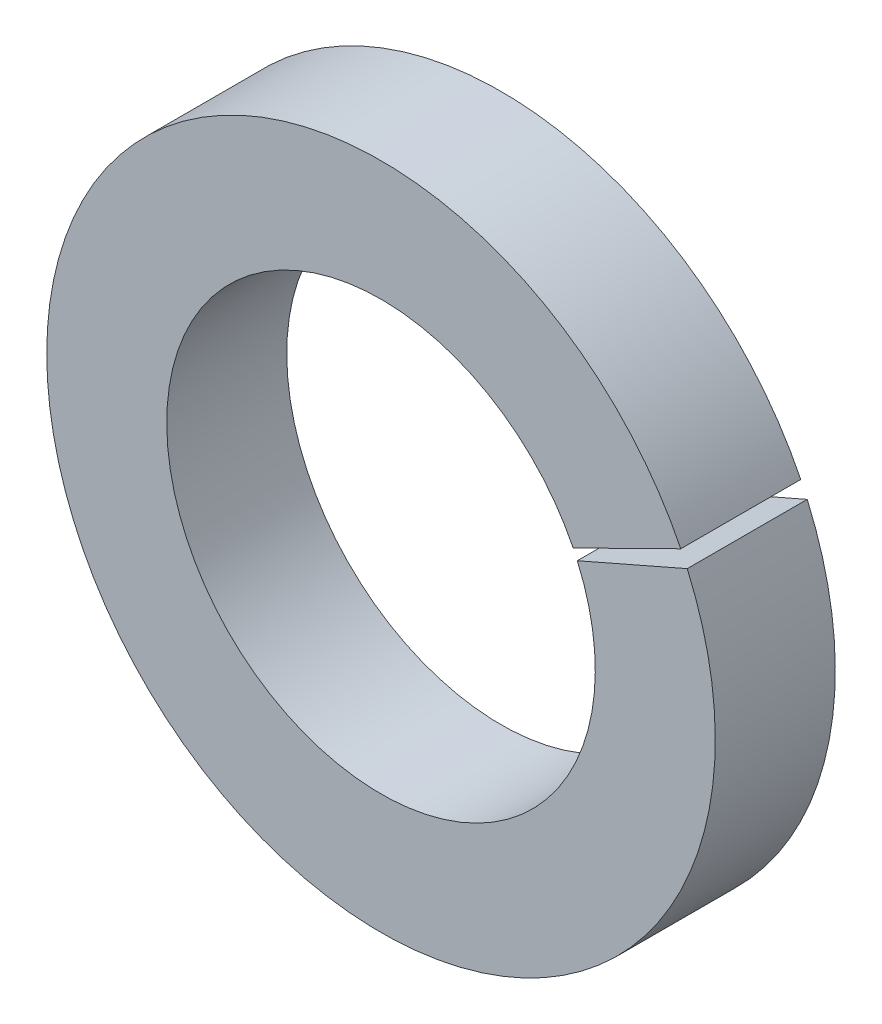
ISO-10303-21;
HEADER;
FILE_DESCRIPTION(('STEP AP214'),'2;1');
FILE_NAME('part.step','',(''),(''),'','','');
FILE_SCHEMA(('AUTOMOTIVE_DESIGN { 1 0 10303 214 1 1 1 1 }'));
ENDSEC;
DATA;
#1=APPLICATION_CONTEXT('core data for automotive mechanical design processes');
#2=APPLICATION_PROTOCOL_DEFINITION('international standard','automotive_design',2000,#1);
#3=PRODUCT_CONTEXT('',#1,'mechanical');
#4=PRODUCT('Part','Part','',(#3));
#5=PRODUCT_RELATED_PRODUCT_CATEGORY('part','',(#4));
#6=PRODUCT_DEFINITION_FORMATION('','',#4);
#7=PRODUCT_DEFINITION_CONTEXT('part definition',#1,'design');
#8=PRODUCT_DEFINITION('design','',#6,#7);
#9=PRODUCT_DEFINITION_SHAPE('','',#8);
#10=(LENGTH_UNIT() NAMED_UNIT(*) SI_UNIT(.MILLI.,.METRE.));
#11=(NAMED_UNIT(*) PLANE_ANGLE_UNIT() SI_UNIT($,.RADIAN.));
#12=(NAMED_UNIT(*) SI_UNIT($,.STERADIAN.) SOLID_ANGLE_UNIT());
#13=UNCERTAINTY_MEASURE_WITH_UNIT(LENGTH_MEASURE(1.E-05),#10,'distance_accuracy_value','');
#14=(GEOMETRIC_REPRESENTATION_CONTEXT(3) GLOBAL_UNCERTAINTY_ASSIGNED_CONTEXT((#13)) GLOBAL_UNIT_ASSIGNED_CONTEXT((#10,
#11,#12)) REPRESENTATION_CONTEXT('',''));
#15=CARTESIAN_POINT('',(0.,0.,0.));
#16=DIRECTION('',(0.,0.,1.));
#17=DIRECTION('',(1.,0.,0.));
#18=AXIS2_PLACEMENT_3D('',#15,#16,#17);
#19=CARTESIAN_POINT('',(0.,0.,1.4));
#20=DIRECTION('',(0.,0.,1.));
#21=DIRECTION('',(1.,0.,0.));
#22=AXIS2_PLACEMENT_3D('',#19,#20,#21);
#23=PLANE('',#22);
#24=DIRECTION('',(0.91612800253932,0.400885872741003,0.));
#25=VECTOR('',#24,1.);
#26=CARTESIAN_POINT('',(4.81245926481222,2.10587049741662,1.4));
#27=LINE('',#26,#25);
#28=CARTESIAN_POINT('',(2.2903200063483,1.00221468185251,1.4));
#29=VERTEX_POINT('',#28);
#30=CARTESIAN_POINT('',(3.57289920990335,1.56345490368991,1.4));
#31=VERTEX_POINT('',#30);
#32=EDGE_CURVE('E79',#29,#31,#27,.T.);
#33=ORIENTED_EDGE('',*,*,#32,.F.);
#34=CARTESIAN_POINT('',(0.,0.,1.4));
#35=DIRECTION('',(0.,0.,1.));
#36=DIRECTION('',(1.,0.,0.));
#37=AXIS2_PLACEMENT_3D('',#34,#35,#36);
#38=CIRCLE('',#37,2.5);
#39=CARTESIAN_POINT('',(2.24175115793534,1.10659466196776,1.4));
#40=VERTEX_POINT('',#39);
#41=EDGE_CURVE('E88',#40,#29,#38,.T.);
#42=ORIENTED_EDGE('',*,*,#41,.F.);
#43=DIRECTION('',(-0.896700463174137,-0.442637864787105,0.));
#44=VECTOR('',#43,1.);
#45=CARTESIAN_POINT('',(0.,0.,1.4));
#46=LINE('',#45,#44);
#47=CARTESIAN_POINT('',(3.49713180637914,1.72628767266971,1.4));
#48=VERTEX_POINT('',#47);
#49=EDGE_CURVE('E62',#48,#40,#46,.T.);
#50=ORIENTED_EDGE('',*,*,#49,.F.);
#51=CARTESIAN_POINT('',(0.,0.,1.4));
#52=DIRECTION('',(0.,0.,1.));
#53=DIRECTION('',(1.,0.,0.));
#54=AXIS2_PLACEMENT_3D('',#51,#52,#53);
#55=CIRCLE('',#54,3.9);
#56=EDGE_CURVE('E90',#48,#31,#55,.T.);
#57=ORIENTED_EDGE('',*,*,#56,.T.);
#58=EDGE_LOOP('',(#33,#42,#50,#57));
#59=FACE_BOUND('',#58,.T.);
#60=ADVANCED_FACE('F39',(#59),#23,.T.);
#61=CARTESIAN_POINT('',(0.,0.,0.));
#62=DIRECTION('',(0.,0.,1.));
#63=DIRECTION('',(1.,0.,0.));
#64=AXIS2_PLACEMENT_3D('',#61,#62,#63);
#65=PLANE('',#64);
#66=CARTESIAN_POINT('',(0.,0.,0.));
#67=DIRECTION('',(0.,0.,1.));
#68=DIRECTION('',(1.,0.,0.));
#69=AXIS2_PLACEMENT_3D('',#66,#67,#68);
#70=CIRCLE('',#69,2.5);
#71=CARTESIAN_POINT('',(2.24175115793534,1.10659466196776,0.));
#72=VERTEX_POINT('',#71);
#73=CARTESIAN_POINT('',(2.2903200063483,1.00221468185251,0.));
#74=VERTEX_POINT('',#73);
#75=EDGE_CURVE('E96',#72,#74,#70,.T.);
#76=ORIENTED_EDGE('',*,*,#75,.T.);
#77=DIRECTION('',(0.91612800253932,0.400885872741003,0.));
#78=VECTOR('',#77,1.);
#79=CARTESIAN_POINT('',(0.,0.,0.));
#80=LINE('',#79,#78);
#81=CARTESIAN_POINT('',(3.57289920990335,1.56345490368991,0.));
#82=VERTEX_POINT('',#81);
#83=EDGE_CURVE('E54',#74,#82,#80,.T.);
#84=ORIENTED_EDGE('',*,*,#83,.T.);
#85=CARTESIAN_POINT('',(0.,0.,0.));
#86=DIRECTION('',(0.,0.,1.));
#87=DIRECTION('',(1.,0.,0.));
#88=AXIS2_PLACEMENT_3D('',#85,#86,#87);
#89=CIRCLE('',#88,3.9);
#90=CARTESIAN_POINT('',(3.49713180637914,1.72628767266971,0.));
#91=VERTEX_POINT('',#90);
#92=EDGE_CURVE('E95',#91,#82,#89,.T.);
#93=ORIENTED_EDGE('',*,*,#92,.F.);
#94=DIRECTION('',(-0.896700463174138,-0.442637864787105,0.));
#95=VECTOR('',#94,1.);
#96=CARTESIAN_POINT('',(0.,0.,0.));
#97=LINE('',#96,#95);
#98=EDGE_CURVE('E111',#91,#72,#97,.T.);
#99=ORIENTED_EDGE('',*,*,#98,.T.);
#100=EDGE_LOOP('',(#76,#84,#93,#99));
#101=FACE_BOUND('',#100,.T.);
#102=ADVANCED_FACE('F115',(#101),#65,.F.);
#103=CARTESIAN_POINT('',(0.,0.,1.4));
#104=DIRECTION('',(0.,0.,-1.));
#105=DIRECTION('',(-1.,0.,0.));
#106=AXIS2_PLACEMENT_3D('',#103,#104,#105);
#107=CYLINDRICAL_SURFACE('',#106,3.9);
#108=ORIENTED_EDGE('',*,*,#92,.T.);
#109=DIRECTION('',(0.,0.,-1.));
#110=VECTOR('',#109,1.);
#111=CARTESIAN_POINT('',(3.57289920990335,1.56345490368991,1.4));
#112=LINE('',#111,#110);
#113=EDGE_CURVE('E102',#82,#31,#112,.F.);
#114=ORIENTED_EDGE('',*,*,#113,.T.);
#115=ORIENTED_EDGE('',*,*,#56,.F.);
#116=DIRECTION('',(0.,0.,-1.));
#117=VECTOR('',#116,1.);
#118=CARTESIAN_POINT('',(3.49713180637914,1.72628767266971,1.4));
#119=LINE('',#118,#117);
#120=EDGE_CURVE('E117',#48,#91,#119,.T.);
#121=ORIENTED_EDGE('',*,*,#120,.T.);
#122=EDGE_LOOP('',(#108,#114,#115,#121));
#123=FACE_BOUND('',#122,.T.);
#124=ADVANCED_FACE('F41',(#123),#107,.T.);
#125=CARTESIAN_POINT('',(0.,0.,1.4));
#126=DIRECTION('',(0.,0.,-1.));
#127=DIRECTION('',(-1.,0.,0.));
#128=AXIS2_PLACEMENT_3D('',#125,#126,#127);
#129=CYLINDRICAL_SURFACE('',#128,2.5);
#130=DIRECTION('',(0.,0.,-1.));
#131=VECTOR('',#130,1.);
#132=CARTESIAN_POINT('',(2.2903200063483,1.00221468185251,1.4));
#133=LINE('',#132,#131);
#134=EDGE_CURVE('E11',#74,#29,#133,.F.);
#135=ORIENTED_EDGE('',*,*,#134,.F.);
#136=ORIENTED_EDGE('',*,*,#75,.F.);
#137=DIRECTION('',(0.,0.,-1.));
#138=VECTOR('',#137,1.);
#139=CARTESIAN_POINT('',(2.24175115793534,1.10659466196776,1.4));
#140=LINE('',#139,#138);
#141=EDGE_CURVE('E48',#40,#72,#140,.T.);
#142=ORIENTED_EDGE('',*,*,#141,.F.);
#143=ORIENTED_EDGE('',*,*,#41,.T.);
#144=EDGE_LOOP('',(#135,#136,#142,#143));
#145=FACE_BOUND('',#144,.T.);
#146=ADVANCED_FACE('F93',(#145),#129,.F.);
#147=CARTESIAN_POINT('',(0.,0.,-8.6));
#148=DIRECTION('',(-0.442637864787105,0.896700463174138,0.));
#149=DIRECTION('',(-0.896700463174138,-0.442637864787105,0.));
#150=AXIS2_PLACEMENT_3D('',#147,#148,#149);
#151=PLANE('',#150);
#152=ORIENTED_EDGE('',*,*,#49,.T.);
#153=ORIENTED_EDGE('',*,*,#141,.T.);
#154=ORIENTED_EDGE('',*,*,#98,.F.);
#155=ORIENTED_EDGE('',*,*,#120,.F.);
#156=EDGE_LOOP('',(#152,#153,#154,#155));
#157=FACE_BOUND('',#156,.T.);
#158=ADVANCED_FACE('F110',(#157),#151,.F.);
#159=CARTESIAN_POINT('',(4.81245926481222,2.10587049741662,-8.6));
#160=DIRECTION('',(0.400885872741003,-0.91612800253932,0.));
#161=DIRECTION('',(0.91612800253932,0.400885872741003,0.));
#162=AXIS2_PLACEMENT_3D('',#159,#160,#161);
#163=PLANE('',#162);
#164=ORIENTED_EDGE('',*,*,#83,.F.);
#165=ORIENTED_EDGE('',*,*,#134,.T.);
#166=ORIENTED_EDGE('',*,*,#32,.T.);
#167=ORIENTED_EDGE('',*,*,#113,.F.);
#168=EDGE_LOOP('',(#164,#165,#166,#167));
#169=FACE_BOUND('',#168,.T.);
#170=ADVANCED_FACE('F78',(#169),#163,.F.);
#171=CLOSED_SHELL('',(#60,#102,#124,#146,#158,#170));
#172=MANIFOLD_SOLID_BREP('B2',#171);
#173=ADVANCED_BREP_SHAPE_REPRESENTATION('',(#18,#172),#14);
#174=SHAPE_DEFINITION_REPRESENTATION(#9,#173);
ENDSEC;
END-ISO-10303-21;
